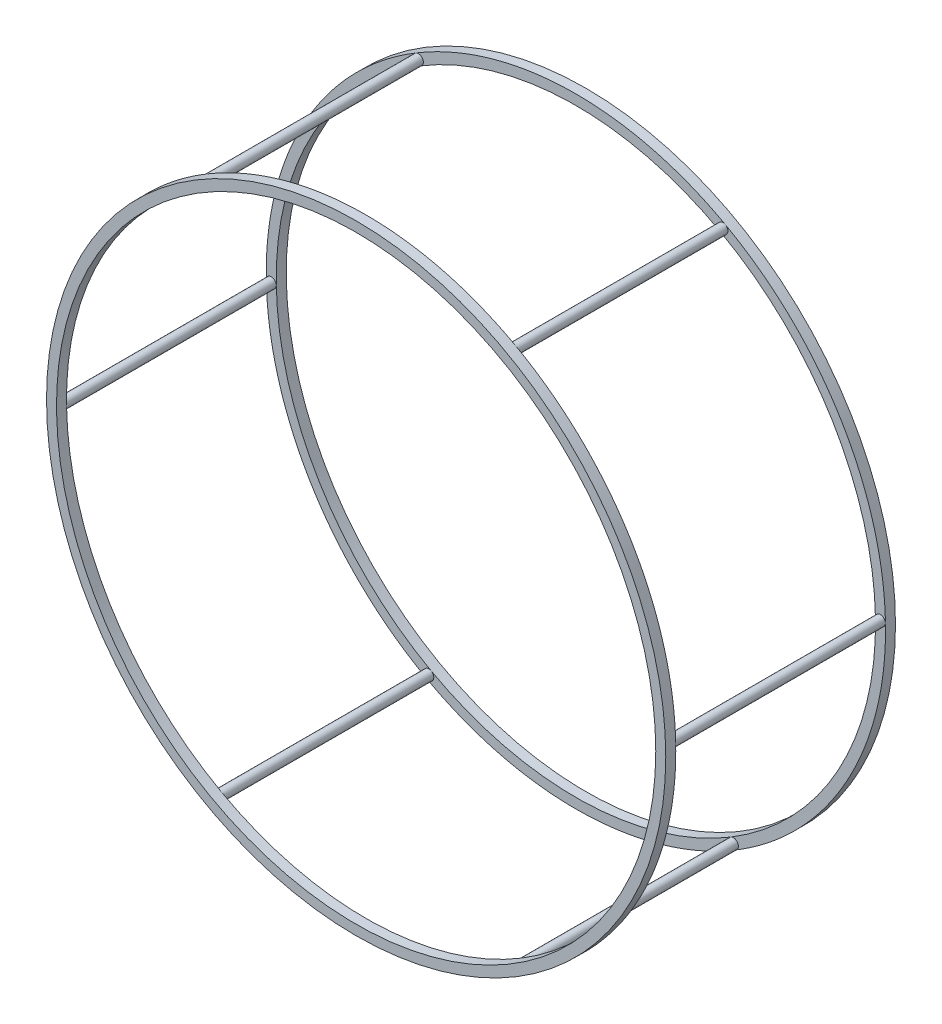
ISO-10303-21;
HEADER;
FILE_DESCRIPTION(('STEP AP214'),'2;1');
FILE_NAME('part.step','',(''),(''),'','','');
FILE_SCHEMA(('AUTOMOTIVE_DESIGN { 1 0 10303 214 1 1 1 1 }'));
ENDSEC;
DATA;
#1=APPLICATION_CONTEXT('core data for automotive mechanical design processes');
#2=APPLICATION_PROTOCOL_DEFINITION('international standard','automotive_design',2000,#1);
#3=PRODUCT_CONTEXT('',#1,'mechanical');
#4=PRODUCT('Part','Part','',(#3));
#5=PRODUCT_RELATED_PRODUCT_CATEGORY('part','',(#4));
#6=PRODUCT_DEFINITION_FORMATION('','',#4);
#7=PRODUCT_DEFINITION_CONTEXT('part definition',#1,'design');
#8=PRODUCT_DEFINITION('design','',#6,#7);
#9=PRODUCT_DEFINITION_SHAPE('','',#8);
#10=(LENGTH_UNIT() NAMED_UNIT(*) SI_UNIT(.MILLI.,.METRE.));
#11=(NAMED_UNIT(*) PLANE_ANGLE_UNIT() SI_UNIT($,.RADIAN.));
#12=(NAMED_UNIT(*) SI_UNIT($,.STERADIAN.) SOLID_ANGLE_UNIT());
#13=UNCERTAINTY_MEASURE_WITH_UNIT(LENGTH_MEASURE(1.E-05),#10,'distance_accuracy_value','');
#14=(GEOMETRIC_REPRESENTATION_CONTEXT(3) GLOBAL_UNCERTAINTY_ASSIGNED_CONTEXT((#13)) GLOBAL_UNIT_ASSIGNED_CONTEXT((#10,
#11,#12)) REPRESENTATION_CONTEXT('',''));
#15=CARTESIAN_POINT('',(0.,0.,0.));
#16=DIRECTION('',(0.,0.,1.));
#17=DIRECTION('',(1.,0.,0.));
#18=AXIS2_PLACEMENT_3D('',#15,#16,#17);
#19=CARTESIAN_POINT('',(0.,0.,115.));
#20=DIRECTION('',(0.,0.,-1.));
#21=DIRECTION('',(-1.,0.,0.));
#22=AXIS2_PLACEMENT_3D('',#19,#20,#21);
#23=CYLINDRICAL_SURFACE('',#22,150.);
#24=CARTESIAN_POINT('',(0.,0.,110.));
#25=DIRECTION('',(0.,0.,1.));
#26=DIRECTION('',(1.,0.,0.));
#27=AXIS2_PLACEMENT_3D('',#24,#25,#26);
#28=CIRCLE('',#27,150.);
#29=CARTESIAN_POINT('',(-77.5535051432016,128.395692451123,110.));
#30=VERTEX_POINT('',#29);
#31=CARTESIAN_POINT('',(-149.970683970767,-2.96545938097858,110.));
#32=VERTEX_POINT('',#31);
#33=EDGE_CURVE('E11',#30,#32,#28,.T.);
#34=ORIENTED_EDGE('',*,*,#33,.F.);
#35=CARTESIAN_POINT('',(72.4171788275641,131.361151832102,110.));
#36=VERTEX_POINT('',#35);
#37=EDGE_CURVE('E45',#36,#30,#28,.T.);
#38=ORIENTED_EDGE('',*,*,#37,.F.);
#39=CARTESIAN_POINT('',(149.970683970767,2.96545938097962,110.));
#40=VERTEX_POINT('',#39);
#41=EDGE_CURVE('E91',#40,#36,#28,.T.);
#42=ORIENTED_EDGE('',*,*,#41,.F.);
#43=CARTESIAN_POINT('',(77.5535051432016,-128.395692451123,110.));
#44=VERTEX_POINT('',#43);
#45=EDGE_CURVE('E100',#44,#40,#28,.T.);
#46=ORIENTED_EDGE('',*,*,#45,.F.);
#47=CARTESIAN_POINT('',(-72.417178827565,-131.361151832102,110.));
#48=VERTEX_POINT('',#47);
#49=EDGE_CURVE('E238',#48,#44,#28,.T.);
#50=ORIENTED_EDGE('',*,*,#49,.F.);
#51=EDGE_CURVE('E43',#32,#48,#28,.T.);
#52=ORIENTED_EDGE('',*,*,#51,.F.);
#53=EDGE_LOOP('',(#34,#38,#42,#46,#50,#52));
#54=FACE_BOUND('',#53,.T.);
#55=CARTESIAN_POINT('',(0.,0.,115.));
#56=DIRECTION('',(0.,0.,1.));
#57=DIRECTION('',(1.,0.,0.));
#58=AXIS2_PLACEMENT_3D('',#55,#56,#57);
#59=CIRCLE('',#58,150.);
#60=CARTESIAN_POINT('',(150.,0.,115.));
#61=VERTEX_POINT('',#60);
#62=EDGE_CURVE('E110',#61,#61,#59,.T.);
#63=ORIENTED_EDGE('',*,*,#62,.T.);
#64=EDGE_LOOP('',(#63));
#65=FACE_BOUND('',#64,.T.);
#66=ADVANCED_FACE('F35',(#54,#65),#23,.F.);
#67=CARTESIAN_POINT('',(0.,0.,115.));
#68=DIRECTION('',(0.,0.,1.));
#69=DIRECTION('',(1.,0.,0.));
#70=AXIS2_PLACEMENT_3D('',#67,#68,#69);
#71=PLANE('',#70);
#72=CARTESIAN_POINT('',(0.,0.,115.));
#73=DIRECTION('',(0.,0.,1.));
#74=DIRECTION('',(1.,0.,0.));
#75=AXIS2_PLACEMENT_3D('',#72,#73,#74);
#76=CIRCLE('',#75,155.);
#77=CARTESIAN_POINT('',(155.,0.,115.));
#78=VERTEX_POINT('',#77);
#79=EDGE_CURVE('E104',#78,#78,#76,.T.);
#80=ORIENTED_EDGE('',*,*,#79,.T.);
#81=EDGE_LOOP('',(#80));
#82=FACE_BOUND('',#81,.T.);
#83=ORIENTED_EDGE('',*,*,#62,.F.);
#84=EDGE_LOOP('',(#83));
#85=FACE_BOUND('',#84,.T.);
#86=ADVANCED_FACE('F192',(#82,#85),#71,.T.);
#87=CARTESIAN_POINT('',(0.,0.,115.));
#88=DIRECTION('',(0.,0.,-1.));
#89=DIRECTION('',(-1.,0.,0.));
#90=AXIS2_PLACEMENT_3D('',#87,#88,#89);
#91=CYLINDRICAL_SURFACE('',#90,155.);
#92=CARTESIAN_POINT('',(0.,0.,110.));
#93=DIRECTION('',(0.,0.,1.));
#94=DIRECTION('',(1.,0.,0.));
#95=AXIS2_PLACEMENT_3D('',#92,#93,#94);
#96=CIRCLE('',#95,155.);
#97=CARTESIAN_POINT('',(155.,0.,110.));
#98=VERTEX_POINT('',#97);
#99=EDGE_CURVE('E38',#98,#98,#96,.T.);
#100=ORIENTED_EDGE('',*,*,#99,.T.);
#101=EDGE_LOOP('',(#100));
#102=FACE_BOUND('',#101,.T.);
#103=ORIENTED_EDGE('',*,*,#79,.F.);
#104=EDGE_LOOP('',(#103));
#105=FACE_BOUND('',#104,.T.);
#106=ADVANCED_FACE('F196',(#102,#105),#91,.T.);
#107=CARTESIAN_POINT('',(-155.,-155.,110.));
#108=DIRECTION('',(0.,0.,1.));
#109=DIRECTION('',(1.,0.,0.));
#110=AXIS2_PLACEMENT_3D('',#107,#108,#109);
#111=PLANE('',#110);
#112=ORIENTED_EDGE('',*,*,#41,.T.);
#113=CARTESIAN_POINT('',(73.6241279388472,133.550497344144,110.));
#114=DIRECTION('',(0.,0.,-1.));
#115=DIRECTION('',(-0.50000000000001,0.866025403784433,0.));
#116=AXIS2_PLACEMENT_3D('',#113,#114,#115);
#117=CIRCLE('',#116,2.4999919856523);
#118=EDGE_CURVE('E95',#36,#36,#117,.T.);
#119=ORIENTED_EDGE('',*,*,#118,.F.);
#120=ORIENTED_EDGE('',*,*,#37,.T.);
#121=CARTESIAN_POINT('',(-78.84605941865,130.53561379859,110.));
#122=DIRECTION('',(0.,0.,-1.));
#123=DIRECTION('',(-1.,0.,0.));
#124=AXIS2_PLACEMENT_3D('',#121,#122,#123);
#125=CIRCLE('',#124,2.4999919856523);
#126=EDGE_CURVE('E113',#30,#30,#125,.T.);
#127=ORIENTED_EDGE('',*,*,#126,.F.);
#128=ORIENTED_EDGE('',*,*,#33,.T.);
#129=CARTESIAN_POINT('',(-152.470187357499,-3.0148835455534,110.));
#130=DIRECTION('',(0.,0.,-1.));
#131=DIRECTION('',(-0.499999999999998,-0.86602540378444,0.));
#132=AXIS2_PLACEMENT_3D('',#129,#130,#131);
#133=CIRCLE('',#132,2.4999919856523);
#134=EDGE_CURVE('E132',#32,#32,#133,.T.);
#135=ORIENTED_EDGE('',*,*,#134,.F.);
#136=ORIENTED_EDGE('',*,*,#51,.T.);
#137=CARTESIAN_POINT('',(-73.6241279388481,-133.550497344144,110.));
#138=DIRECTION('',(0.,0.,-1.));
#139=DIRECTION('',(0.500000000000004,-0.866025403784436,0.));
#140=AXIS2_PLACEMENT_3D('',#137,#138,#139);
#141=CIRCLE('',#140,2.4999919856523);
#142=EDGE_CURVE('E138',#48,#48,#141,.T.);
#143=ORIENTED_EDGE('',*,*,#142,.F.);
#144=ORIENTED_EDGE('',*,*,#49,.T.);
#145=CARTESIAN_POINT('',(78.84605941865,-130.53561379859,110.));
#146=DIRECTION('',(0.,0.,-1.));
#147=DIRECTION('',(1.,0.,0.));
#148=AXIS2_PLACEMENT_3D('',#145,#146,#147);
#149=CIRCLE('',#148,2.4999919856523);
#150=EDGE_CURVE('E144',#44,#44,#149,.T.);
#151=ORIENTED_EDGE('',*,*,#150,.F.);
#152=ORIENTED_EDGE('',*,*,#45,.T.);
#153=CARTESIAN_POINT('',(152.470187357499,3.01488354555446,110.));
#154=DIRECTION('',(0.,0.,-1.));
#155=DIRECTION('',(0.499999999999992,0.866025403784443,0.));
#156=AXIS2_PLACEMENT_3D('',#153,#154,#155);
#157=CIRCLE('',#156,2.4999919856523);
#158=EDGE_CURVE('E97',#40,#40,#157,.T.);
#159=ORIENTED_EDGE('',*,*,#158,.F.);
#160=EDGE_LOOP('',(#112,#119,#120,#127,#128,#135,#136,#143,#144,#151,#152,#159));
#161=FACE_BOUND('',#160,.T.);
#162=ORIENTED_EDGE('',*,*,#99,.F.);
#163=EDGE_LOOP('',(#162));
#164=FACE_BOUND('',#163,.T.);
#165=ADVANCED_FACE('F92',(#161,#164),#111,.F.);
#166=CARTESIAN_POINT('',(-78.84605941865,130.53561379859,-2.07104514386706));
#167=DIRECTION('',(0.,0.,1.));
#168=DIRECTION('',(1.,0.,0.));
#169=AXIS2_PLACEMENT_3D('',#166,#167,#168);
#170=CYLINDRICAL_SURFACE('',#169,2.4999919856523);
#171=ORIENTED_EDGE('',*,*,#126,.T.);
#172=EDGE_LOOP('',(#171));
#173=FACE_BOUND('',#172,.T.);
#174=CARTESIAN_POINT('',(-78.84605941865,130.53561379859,4.99999999999999));
#175=DIRECTION('',(0.,0.,-1.));
#176=DIRECTION('',(0.,1.,0.));
#177=AXIS2_PLACEMENT_3D('',#174,#175,#176);
#178=CIRCLE('',#177,2.4999919856523);
#179=CARTESIAN_POINT('',(-77.5535051432017,128.395692451123,5.));
#180=VERTEX_POINT('',#179);
#181=EDGE_CURVE('E107',#180,#180,#178,.T.);
#182=ORIENTED_EDGE('',*,*,#181,.F.);
#183=EDGE_LOOP('',(#182));
#184=FACE_BOUND('',#183,.T.);
#185=ADVANCED_FACE('F206',(#173,#184),#170,.T.);
#186=CARTESIAN_POINT('',(0.,0.,115.));
#187=DIRECTION('',(0.,0.,-1.));
#188=DIRECTION('',(-1.,0.,0.));
#189=AXIS2_PLACEMENT_3D('',#186,#187,#188);
#190=CYLINDRICAL_SURFACE('',#189,155.);
#191=CARTESIAN_POINT('',(0.,0.,0.));
#192=DIRECTION('',(0.,0.,1.));
#193=DIRECTION('',(1.,0.,0.));
#194=AXIS2_PLACEMENT_3D('',#191,#192,#193);
#195=CIRCLE('',#194,155.);
#196=CARTESIAN_POINT('',(155.,0.,0.));
#197=VERTEX_POINT('',#196);
#198=EDGE_CURVE('E116',#197,#197,#195,.T.);
#199=ORIENTED_EDGE('',*,*,#198,.T.);
#200=EDGE_LOOP('',(#199));
#201=FACE_BOUND('',#200,.T.);
#202=CARTESIAN_POINT('',(0.,0.,5.));
#203=DIRECTION('',(0.,0.,-1.));
#204=DIRECTION('',(0.,1.,0.));
#205=AXIS2_PLACEMENT_3D('',#202,#203,#204);
#206=CIRCLE('',#205,155.);
#207=CARTESIAN_POINT('',(0.,155.,5.));
#208=VERTEX_POINT('',#207);
#209=EDGE_CURVE('E123',#208,#208,#206,.T.);
#210=ORIENTED_EDGE('',*,*,#209,.T.);
#211=EDGE_LOOP('',(#210));
#212=FACE_BOUND('',#211,.T.);
#213=ADVANCED_FACE('F212',(#201,#212),#190,.T.);
#214=CARTESIAN_POINT('',(0.,0.,0.));
#215=DIRECTION('',(0.,0.,1.));
#216=DIRECTION('',(1.,0.,0.));
#217=AXIS2_PLACEMENT_3D('',#214,#215,#216);
#218=PLANE('',#217);
#219=ORIENTED_EDGE('',*,*,#198,.F.);
#220=EDGE_LOOP('',(#219));
#221=FACE_BOUND('',#220,.T.);
#222=CARTESIAN_POINT('',(0.,0.,0.));
#223=DIRECTION('',(0.,0.,1.));
#224=DIRECTION('',(1.,0.,0.));
#225=AXIS2_PLACEMENT_3D('',#222,#223,#224);
#226=CIRCLE('',#225,150.);
#227=CARTESIAN_POINT('',(150.,0.,0.));
#228=VERTEX_POINT('',#227);
#229=EDGE_CURVE('E119',#228,#228,#226,.T.);
#230=ORIENTED_EDGE('',*,*,#229,.T.);
#231=EDGE_LOOP('',(#230));
#232=FACE_BOUND('',#231,.T.);
#233=ADVANCED_FACE('F216',(#221,#232),#218,.F.);
#234=CARTESIAN_POINT('',(0.,0.,115.));
#235=DIRECTION('',(0.,0.,-1.));
#236=DIRECTION('',(-1.,0.,0.));
#237=AXIS2_PLACEMENT_3D('',#234,#235,#236);
#238=CYLINDRICAL_SURFACE('',#237,150.);
#239=CARTESIAN_POINT('',(0.,0.,5.));
#240=DIRECTION('',(0.,0.,-1.));
#241=DIRECTION('',(0.,1.,0.));
#242=AXIS2_PLACEMENT_3D('',#239,#240,#241);
#243=CIRCLE('',#242,150.);
#244=CARTESIAN_POINT('',(72.4171788275641,131.361151832102,4.99999999999999));
#245=VERTEX_POINT('',#244);
#246=EDGE_CURVE('E122',#180,#245,#243,.T.);
#247=ORIENTED_EDGE('',*,*,#246,.F.);
#248=CARTESIAN_POINT('',(-149.970683970767,-2.96545938097858,5.));
#249=VERTEX_POINT('',#248);
#250=EDGE_CURVE('E59',#249,#180,#243,.T.);
#251=ORIENTED_EDGE('',*,*,#250,.F.);
#252=CARTESIAN_POINT('',(-72.417178827565,-131.361151832102,5.));
#253=VERTEX_POINT('',#252);
#254=EDGE_CURVE('E171',#253,#249,#243,.T.);
#255=ORIENTED_EDGE('',*,*,#254,.F.);
#256=CARTESIAN_POINT('',(77.5535051432016,-128.395692451123,5.));
#257=VERTEX_POINT('',#256);
#258=EDGE_CURVE('E170',#257,#253,#243,.T.);
#259=ORIENTED_EDGE('',*,*,#258,.F.);
#260=CARTESIAN_POINT('',(149.970683970767,2.96545938097962,4.99999999999999));
#261=VERTEX_POINT('',#260);
#262=EDGE_CURVE('E169',#261,#257,#243,.T.);
#263=ORIENTED_EDGE('',*,*,#262,.F.);
#264=EDGE_CURVE('E124',#245,#261,#243,.T.);
#265=ORIENTED_EDGE('',*,*,#264,.F.);
#266=EDGE_LOOP('',(#247,#251,#255,#259,#263,#265));
#267=FACE_BOUND('',#266,.T.);
#268=ORIENTED_EDGE('',*,*,#229,.F.);
#269=EDGE_LOOP('',(#268));
#270=FACE_BOUND('',#269,.T.);
#271=ADVANCED_FACE('F166',(#267,#270),#238,.F.);
#272=CARTESIAN_POINT('',(-155.,-155.,5.));
#273=DIRECTION('',(0.,0.,-1.));
#274=DIRECTION('',(0.,1.,0.));
#275=AXIS2_PLACEMENT_3D('',#272,#273,#274);
#276=PLANE('',#275);
#277=ORIENTED_EDGE('',*,*,#246,.T.);
#278=CARTESIAN_POINT('',(73.6241279388472,133.550497344144,4.99999999999999));
#279=DIRECTION('',(0.,0.,-1.));
#280=DIRECTION('',(0.,1.,0.));
#281=AXIS2_PLACEMENT_3D('',#278,#279,#280);
#282=CIRCLE('',#281,2.4999919856523);
#283=EDGE_CURVE('E151',#245,#245,#282,.T.);
#284=ORIENTED_EDGE('',*,*,#283,.T.);
#285=ORIENTED_EDGE('',*,*,#264,.T.);
#286=CARTESIAN_POINT('',(152.470187357499,3.01488354555446,4.99999999999999));
#287=DIRECTION('',(0.,0.,-1.));
#288=DIRECTION('',(0.,1.,0.));
#289=AXIS2_PLACEMENT_3D('',#286,#287,#288);
#290=CIRCLE('',#289,2.4999919856523);
#291=EDGE_CURVE('E147',#261,#261,#290,.T.);
#292=ORIENTED_EDGE('',*,*,#291,.T.);
#293=ORIENTED_EDGE('',*,*,#262,.T.);
#294=CARTESIAN_POINT('',(78.84605941865,-130.53561379859,5.));
#295=DIRECTION('',(0.,0.,-1.));
#296=DIRECTION('',(0.,1.,0.));
#297=AXIS2_PLACEMENT_3D('',#294,#295,#296);
#298=CIRCLE('',#297,2.4999919856523);
#299=EDGE_CURVE('E141',#257,#257,#298,.T.);
#300=ORIENTED_EDGE('',*,*,#299,.T.);
#301=ORIENTED_EDGE('',*,*,#258,.T.);
#302=CARTESIAN_POINT('',(-73.6241279388481,-133.550497344144,5.));
#303=DIRECTION('',(0.,0.,-1.));
#304=DIRECTION('',(0.,1.,0.));
#305=AXIS2_PLACEMENT_3D('',#302,#303,#304);
#306=CIRCLE('',#305,2.4999919856523);
#307=EDGE_CURVE('E135',#253,#253,#306,.T.);
#308=ORIENTED_EDGE('',*,*,#307,.T.);
#309=ORIENTED_EDGE('',*,*,#254,.T.);
#310=CARTESIAN_POINT('',(-152.470187357499,-3.0148835455534,5.));
#311=DIRECTION('',(0.,0.,-1.));
#312=DIRECTION('',(0.,1.,0.));
#313=AXIS2_PLACEMENT_3D('',#310,#311,#312);
#314=CIRCLE('',#313,2.4999919856523);
#315=EDGE_CURVE('E130',#249,#249,#314,.T.);
#316=ORIENTED_EDGE('',*,*,#315,.T.);
#317=ORIENTED_EDGE('',*,*,#250,.T.);
#318=ORIENTED_EDGE('',*,*,#181,.T.);
#319=EDGE_LOOP('',(#277,#284,#285,#292,#293,#300,#301,#308,#309,#316,#317,#318));
#320=FACE_BOUND('',#319,.T.);
#321=ORIENTED_EDGE('',*,*,#209,.F.);
#322=EDGE_LOOP('',(#321));
#323=FACE_BOUND('',#322,.T.);
#324=ADVANCED_FACE('F161',(#320,#323),#276,.F.);
#325=CARTESIAN_POINT('',(-152.470187357499,-3.0148835455534,-2.07104514386702));
#326=DIRECTION('',(0.,0.,1.));
#327=DIRECTION('',(1.,0.,0.));
#328=AXIS2_PLACEMENT_3D('',#325,#326,#327);
#329=CYLINDRICAL_SURFACE('',#328,2.4999919856523);
#330=ORIENTED_EDGE('',*,*,#134,.T.);
#331=EDGE_LOOP('',(#330));
#332=FACE_BOUND('',#331,.T.);
#333=ORIENTED_EDGE('',*,*,#315,.F.);
#334=EDGE_LOOP('',(#333));
#335=FACE_BOUND('',#334,.T.);
#336=ADVANCED_FACE('F188',(#332,#335),#329,.T.);
#337=CARTESIAN_POINT('',(-73.6241279388481,-133.550497344144,-2.07104514386705));
#338=DIRECTION('',(0.,0.,1.));
#339=DIRECTION('',(1.,0.,0.));
#340=AXIS2_PLACEMENT_3D('',#337,#338,#339);
#341=CYLINDRICAL_SURFACE('',#340,2.4999919856523);
#342=ORIENTED_EDGE('',*,*,#142,.T.);
#343=EDGE_LOOP('',(#342));
#344=FACE_BOUND('',#343,.T.);
#345=ORIENTED_EDGE('',*,*,#307,.F.);
#346=EDGE_LOOP('',(#345));
#347=FACE_BOUND('',#346,.T.);
#348=ADVANCED_FACE('F179',(#344,#347),#341,.T.);
#349=CARTESIAN_POINT('',(78.84605941865,-130.53561379859,-2.07104514386705));
#350=DIRECTION('',(0.,0.,1.));
#351=DIRECTION('',(1.,0.,0.));
#352=AXIS2_PLACEMENT_3D('',#349,#350,#351);
#353=CYLINDRICAL_SURFACE('',#352,2.4999919856523);
#354=ORIENTED_EDGE('',*,*,#150,.T.);
#355=EDGE_LOOP('',(#354));
#356=FACE_BOUND('',#355,.T.);
#357=ORIENTED_EDGE('',*,*,#299,.F.);
#358=EDGE_LOOP('',(#357));
#359=FACE_BOUND('',#358,.T.);
#360=ADVANCED_FACE('F177',(#356,#359),#353,.T.);
#361=CARTESIAN_POINT('',(152.470187357499,3.01488354555446,-2.07104514386702));
#362=DIRECTION('',(0.,0.,1.));
#363=DIRECTION('',(1.,0.,0.));
#364=AXIS2_PLACEMENT_3D('',#361,#362,#363);
#365=CYLINDRICAL_SURFACE('',#364,2.4999919856523);
#366=ORIENTED_EDGE('',*,*,#158,.T.);
#367=EDGE_LOOP('',(#366));
#368=FACE_BOUND('',#367,.T.);
#369=ORIENTED_EDGE('',*,*,#291,.F.);
#370=EDGE_LOOP('',(#369));
#371=FACE_BOUND('',#370,.T.);
#372=ADVANCED_FACE('F158',(#368,#371),#365,.T.);
#373=CARTESIAN_POINT('',(73.6241279388472,133.550497344144,-2.07104514386706));
#374=DIRECTION('',(0.,0.,1.));
#375=DIRECTION('',(1.,0.,0.));
#376=AXIS2_PLACEMENT_3D('',#373,#374,#375);
#377=CYLINDRICAL_SURFACE('',#376,2.4999919856523);
#378=ORIENTED_EDGE('',*,*,#118,.T.);
#379=EDGE_LOOP('',(#378));
#380=FACE_BOUND('',#379,.T.);
#381=ORIENTED_EDGE('',*,*,#283,.F.);
#382=EDGE_LOOP('',(#381));
#383=FACE_BOUND('',#382,.T.);
#384=ADVANCED_FACE('F155',(#380,#383),#377,.T.);
#385=CLOSED_SHELL('',(#66,#86,#106,#165,#185,#213,#233,#271,#324,#336,#348,#360,#372,#384));
#386=MANIFOLD_SOLID_BREP('B2',#385);
#387=ADVANCED_BREP_SHAPE_REPRESENTATION('',(#18,#386),#14);
#388=SHAPE_DEFINITION_REPRESENTATION(#9,#387);
ENDSEC;
END-ISO-10303-21;
